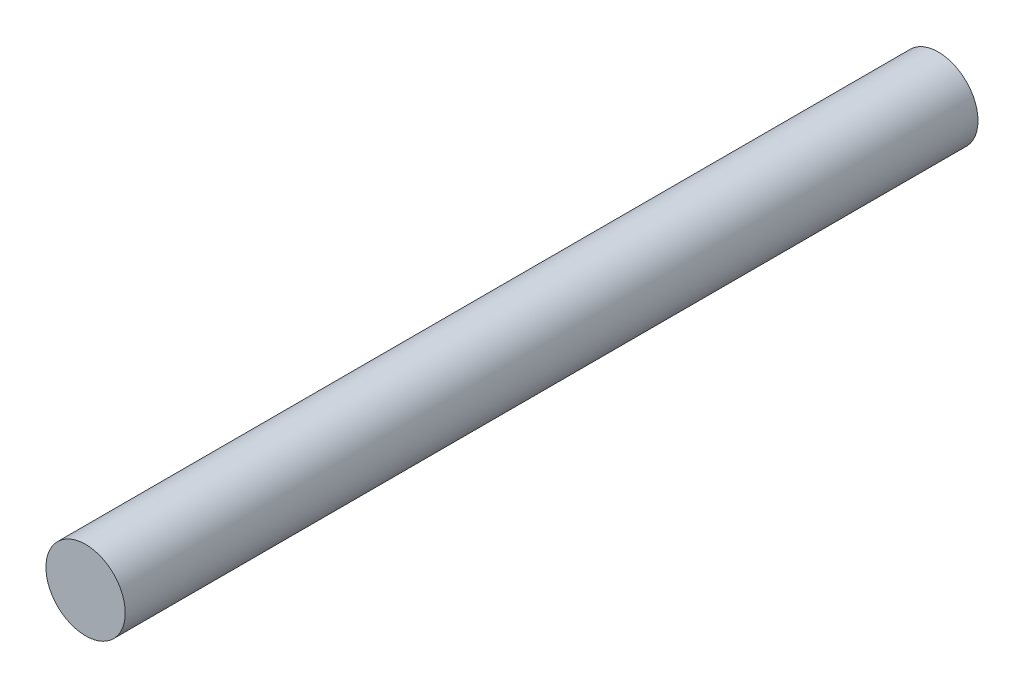
ISO-10303-21;
HEADER;
FILE_DESCRIPTION(('STEP AP214'),'2;1');
FILE_NAME('part.step','',(''),(''),'','','');
FILE_SCHEMA(('AUTOMOTIVE_DESIGN { 1 0 10303 214 1 1 1 1 }'));
ENDSEC;
DATA;
#1=APPLICATION_CONTEXT('core data for automotive mechanical design processes');
#2=APPLICATION_PROTOCOL_DEFINITION('international standard','automotive_design',2000,#1);
#3=PRODUCT_CONTEXT('',#1,'mechanical');
#4=PRODUCT('Part','Part','',(#3));
#5=PRODUCT_RELATED_PRODUCT_CATEGORY('part','',(#4));
#6=PRODUCT_DEFINITION_FORMATION('','',#4);
#7=PRODUCT_DEFINITION_CONTEXT('part definition',#1,'design');
#8=PRODUCT_DEFINITION('design','',#6,#7);
#9=PRODUCT_DEFINITION_SHAPE('','',#8);
#10=(LENGTH_UNIT() NAMED_UNIT(*) SI_UNIT(.MILLI.,.METRE.));
#11=(NAMED_UNIT(*) PLANE_ANGLE_UNIT() SI_UNIT($,.RADIAN.));
#12=(NAMED_UNIT(*) SI_UNIT($,.STERADIAN.) SOLID_ANGLE_UNIT());
#13=UNCERTAINTY_MEASURE_WITH_UNIT(LENGTH_MEASURE(1.E-05),#10,'distance_accuracy_value','');
#14=(GEOMETRIC_REPRESENTATION_CONTEXT(3) GLOBAL_UNCERTAINTY_ASSIGNED_CONTEXT((#13)) GLOBAL_UNIT_ASSIGNED_CONTEXT((#10,
#11,#12)) REPRESENTATION_CONTEXT('',''));
#15=CARTESIAN_POINT('',(0.,0.,0.));
#16=DIRECTION('',(0.,0.,1.));
#17=DIRECTION('',(1.,0.,0.));
#18=AXIS2_PLACEMENT_3D('',#15,#16,#17);
#19=CARTESIAN_POINT('',(0.,0.,43.));
#20=DIRECTION('',(0.,0.,-1.));
#21=DIRECTION('',(-1.,0.,0.));
#22=AXIS2_PLACEMENT_3D('',#19,#20,#21);
#23=CYLINDRICAL_SURFACE('',#22,2.);
#24=CARTESIAN_POINT('',(0.,0.,43.));
#25=DIRECTION('',(0.,0.,1.));
#26=DIRECTION('',(1.,0.,0.));
#27=AXIS2_PLACEMENT_3D('',#24,#25,#26);
#28=CIRCLE('',#27,2.);
#29=CARTESIAN_POINT('',(2.,0.,43.));
#30=VERTEX_POINT('',#29);
#31=EDGE_CURVE('E10',#30,#30,#28,.T.);
#32=ORIENTED_EDGE('',*,*,#31,.F.);
#33=EDGE_LOOP('',(#32));
#34=FACE_BOUND('',#33,.T.);
#35=CARTESIAN_POINT('',(0.,0.,0.));
#36=DIRECTION('',(0.,0.,1.));
#37=DIRECTION('',(1.,0.,0.));
#38=AXIS2_PLACEMENT_3D('',#35,#36,#37);
#39=CIRCLE('',#38,2.);
#40=CARTESIAN_POINT('',(2.,0.,0.));
#41=VERTEX_POINT('',#40);
#42=EDGE_CURVE('E34',#41,#41,#39,.T.);
#43=ORIENTED_EDGE('',*,*,#42,.T.);
#44=EDGE_LOOP('',(#43));
#45=FACE_BOUND('',#44,.T.);
#46=ADVANCED_FACE('F31',(#34,#45),#23,.T.);
#47=CARTESIAN_POINT('',(0.,0.,43.));
#48=DIRECTION('',(0.,0.,1.));
#49=DIRECTION('',(1.,0.,0.));
#50=AXIS2_PLACEMENT_3D('',#47,#48,#49);
#51=PLANE('',#50);
#52=ORIENTED_EDGE('',*,*,#31,.T.);
#53=EDGE_LOOP('',(#52));
#54=FACE_BOUND('',#53,.T.);
#55=ADVANCED_FACE('F46',(#54),#51,.T.);
#56=CARTESIAN_POINT('',(0.,0.,0.));
#57=DIRECTION('',(0.,0.,1.));
#58=DIRECTION('',(1.,0.,0.));
#59=AXIS2_PLACEMENT_3D('',#56,#57,#58);
#60=PLANE('',#59);
#61=ORIENTED_EDGE('',*,*,#42,.F.);
#62=EDGE_LOOP('',(#61));
#63=FACE_BOUND('',#62,.T.);
#64=ADVANCED_FACE('F44',(#63),#60,.F.);
#65=CLOSED_SHELL('',(#46,#55,#64));
#66=MANIFOLD_SOLID_BREP('B2',#65);
#67=ADVANCED_BREP_SHAPE_REPRESENTATION('',(#18,#66),#14);
#68=SHAPE_DEFINITION_REPRESENTATION(#9,#67);
ENDSEC;
END-ISO-10303-21;
